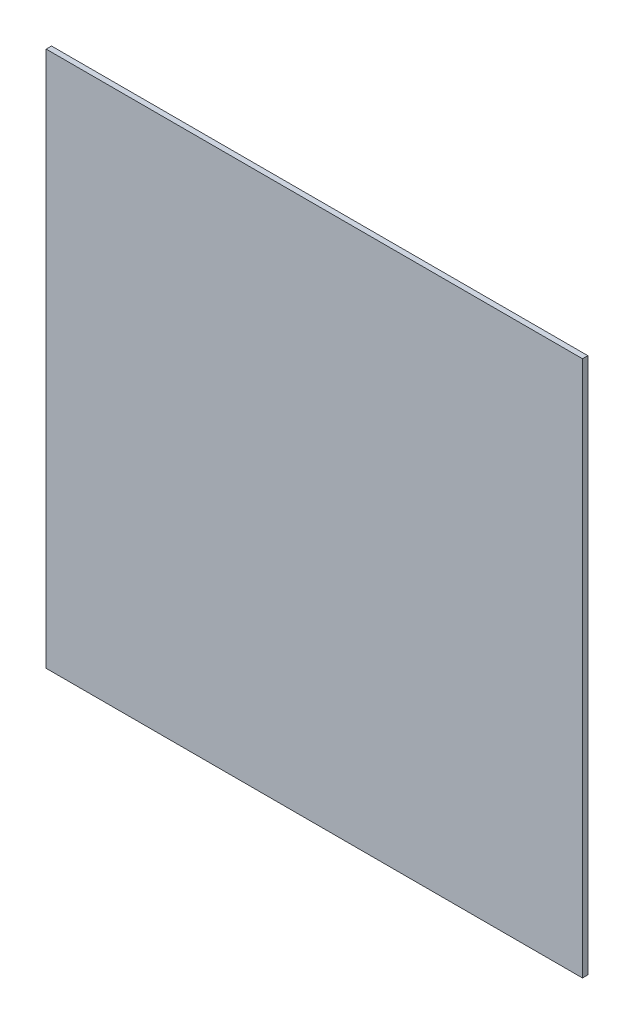
ISO-10303-21;
HEADER;
FILE_DESCRIPTION(('STEP AP214'),'2;1');
FILE_NAME('part.step','',(''),(''),'','','');
FILE_SCHEMA(('AUTOMOTIVE_DESIGN { 1 0 10303 214 1 1 1 1 }'));
ENDSEC;
DATA;
#1=APPLICATION_CONTEXT('core data for automotive mechanical design processes');
#2=APPLICATION_PROTOCOL_DEFINITION('international standard','automotive_design',2000,#1);
#3=PRODUCT_CONTEXT('',#1,'mechanical');
#4=PRODUCT('Part','Part','',(#3));
#5=PRODUCT_RELATED_PRODUCT_CATEGORY('part','',(#4));
#6=PRODUCT_DEFINITION_FORMATION('','',#4);
#7=PRODUCT_DEFINITION_CONTEXT('part definition',#1,'design');
#8=PRODUCT_DEFINITION('design','',#6,#7);
#9=PRODUCT_DEFINITION_SHAPE('','',#8);
#10=(LENGTH_UNIT() NAMED_UNIT(*) SI_UNIT(.MILLI.,.METRE.));
#11=(NAMED_UNIT(*) PLANE_ANGLE_UNIT() SI_UNIT($,.RADIAN.));
#12=(NAMED_UNIT(*) SI_UNIT($,.STERADIAN.) SOLID_ANGLE_UNIT());
#13=UNCERTAINTY_MEASURE_WITH_UNIT(LENGTH_MEASURE(1.E-05),#10,'distance_accuracy_value','');
#14=(GEOMETRIC_REPRESENTATION_CONTEXT(3) GLOBAL_UNCERTAINTY_ASSIGNED_CONTEXT((#13)) GLOBAL_UNIT_ASSIGNED_CONTEXT((#10,
#11,#12)) REPRESENTATION_CONTEXT('',''));
#15=CARTESIAN_POINT('',(0.,0.,0.));
#16=DIRECTION('',(0.,0.,1.));
#17=DIRECTION('',(1.,0.,0.));
#18=AXIS2_PLACEMENT_3D('',#15,#16,#17);
#19=CARTESIAN_POINT('',(0.,0.,4.));
#20=DIRECTION('',(1.,0.,0.));
#21=DIRECTION('',(0.,1.,0.));
#22=AXIS2_PLACEMENT_3D('',#19,#20,#21);
#23=PLANE('',#22);
#24=DIRECTION('',(0.,-1.,0.));
#25=VECTOR('',#24,1.);
#26=CARTESIAN_POINT('',(0.,0.,0.));
#27=LINE('',#26,#25);
#28=CARTESIAN_POINT('',(0.,0.,0.));
#29=VERTEX_POINT('',#28);
#30=CARTESIAN_POINT('',(0.,-400.,0.));
#31=VERTEX_POINT('',#30);
#32=EDGE_CURVE('E100',#29,#31,#27,.T.);
#33=ORIENTED_EDGE('',*,*,#32,.T.);
#34=DIRECTION('',(0.,0.,-1.));
#35=VECTOR('',#34,1.);
#36=CARTESIAN_POINT('',(0.,-400.,4.));
#37=LINE('',#36,#35);
#38=CARTESIAN_POINT('',(0.,-400.,4.));
#39=VERTEX_POINT('',#38);
#40=EDGE_CURVE('E11',#39,#31,#37,.T.);
#41=ORIENTED_EDGE('',*,*,#40,.F.);
#42=DIRECTION('',(0.,-1.,0.));
#43=VECTOR('',#42,1.);
#44=CARTESIAN_POINT('',(0.,0.,4.));
#45=LINE('',#44,#43);
#46=CARTESIAN_POINT('',(0.,0.,4.));
#47=VERTEX_POINT('',#46);
#48=EDGE_CURVE('E88',#47,#39,#45,.T.);
#49=ORIENTED_EDGE('',*,*,#48,.F.);
#50=DIRECTION('',(0.,0.,-1.));
#51=VECTOR('',#50,1.);
#52=CARTESIAN_POINT('',(0.,0.,4.));
#53=LINE('',#52,#51);
#54=EDGE_CURVE('E96',#47,#29,#53,.T.);
#55=ORIENTED_EDGE('',*,*,#54,.T.);
#56=EDGE_LOOP('',(#33,#41,#49,#55));
#57=FACE_BOUND('',#56,.T.);
#58=ADVANCED_FACE('F37',(#57),#23,.F.);
#59=CARTESIAN_POINT('',(0.,-400.,4.));
#60=DIRECTION('',(0.,1.,0.));
#61=DIRECTION('',(0.,0.,1.));
#62=AXIS2_PLACEMENT_3D('',#59,#60,#61);
#63=PLANE('',#62);
#64=DIRECTION('',(1.,0.,0.));
#65=VECTOR('',#64,1.);
#66=CARTESIAN_POINT('',(0.,-400.,0.));
#67=LINE('',#66,#65);
#68=CARTESIAN_POINT('',(400.,-400.,0.));
#69=VERTEX_POINT('',#68);
#70=EDGE_CURVE('E92',#31,#69,#67,.T.);
#71=ORIENTED_EDGE('',*,*,#70,.T.);
#72=DIRECTION('',(0.,0.,-1.));
#73=VECTOR('',#72,1.);
#74=CARTESIAN_POINT('',(400.,-400.,4.));
#75=LINE('',#74,#73);
#76=CARTESIAN_POINT('',(400.,-400.,4.));
#77=VERTEX_POINT('',#76);
#78=EDGE_CURVE('E45',#77,#69,#75,.T.);
#79=ORIENTED_EDGE('',*,*,#78,.F.);
#80=DIRECTION('',(1.,0.,0.));
#81=VECTOR('',#80,1.);
#82=CARTESIAN_POINT('',(0.,-400.,4.));
#83=LINE('',#82,#81);
#84=EDGE_CURVE('E83',#39,#77,#83,.T.);
#85=ORIENTED_EDGE('',*,*,#84,.F.);
#86=ORIENTED_EDGE('',*,*,#40,.T.);
#87=EDGE_LOOP('',(#71,#79,#85,#86));
#88=FACE_BOUND('',#87,.T.);
#89=ADVANCED_FACE('F91',(#88),#63,.F.);
#90=CARTESIAN_POINT('',(400.,0.,4.));
#91=DIRECTION('',(-1.,0.,0.));
#92=DIRECTION('',(0.,-1.,0.));
#93=AXIS2_PLACEMENT_3D('',#90,#91,#92);
#94=PLANE('',#93);
#95=DIRECTION('',(0.,1.,0.));
#96=VECTOR('',#95,1.);
#97=CARTESIAN_POINT('',(400.,0.,0.));
#98=LINE('',#97,#96);
#99=CARTESIAN_POINT('',(400.,0.,0.));
#100=VERTEX_POINT('',#99);
#101=EDGE_CURVE('E70',#69,#100,#98,.T.);
#102=ORIENTED_EDGE('',*,*,#101,.T.);
#103=DIRECTION('',(0.,0.,-1.));
#104=VECTOR('',#103,1.);
#105=CARTESIAN_POINT('',(400.,0.,4.));
#106=LINE('',#105,#104);
#107=CARTESIAN_POINT('',(400.,0.,4.));
#108=VERTEX_POINT('',#107);
#109=EDGE_CURVE('E93',#108,#100,#106,.T.);
#110=ORIENTED_EDGE('',*,*,#109,.F.);
#111=DIRECTION('',(0.,1.,0.));
#112=VECTOR('',#111,1.);
#113=CARTESIAN_POINT('',(400.,0.,4.));
#114=LINE('',#113,#112);
#115=EDGE_CURVE('E86',#77,#108,#114,.T.);
#116=ORIENTED_EDGE('',*,*,#115,.F.);
#117=ORIENTED_EDGE('',*,*,#78,.T.);
#118=EDGE_LOOP('',(#102,#110,#116,#117));
#119=FACE_BOUND('',#118,.T.);
#120=ADVANCED_FACE('F94',(#119),#94,.F.);
#121=CARTESIAN_POINT('',(0.,0.,4.));
#122=DIRECTION('',(0.,-1.,0.));
#123=DIRECTION('',(0.,0.,-1.));
#124=AXIS2_PLACEMENT_3D('',#121,#122,#123);
#125=PLANE('',#124);
#126=DIRECTION('',(-1.,0.,0.));
#127=VECTOR('',#126,1.);
#128=CARTESIAN_POINT('',(0.,0.,0.));
#129=LINE('',#128,#127);
#130=EDGE_CURVE('E76',#100,#29,#129,.T.);
#131=ORIENTED_EDGE('',*,*,#130,.T.);
#132=ORIENTED_EDGE('',*,*,#54,.F.);
#133=DIRECTION('',(-1.,0.,0.));
#134=VECTOR('',#133,1.);
#135=CARTESIAN_POINT('',(0.,0.,4.));
#136=LINE('',#135,#134);
#137=EDGE_CURVE('E53',#108,#47,#136,.T.);
#138=ORIENTED_EDGE('',*,*,#137,.F.);
#139=ORIENTED_EDGE('',*,*,#109,.T.);
#140=EDGE_LOOP('',(#131,#132,#138,#139));
#141=FACE_BOUND('',#140,.T.);
#142=ADVANCED_FACE('F107',(#141),#125,.F.);
#143=CARTESIAN_POINT('',(0.,0.,4.));
#144=DIRECTION('',(0.,0.,1.));
#145=DIRECTION('',(1.,0.,0.));
#146=AXIS2_PLACEMENT_3D('',#143,#144,#145);
#147=PLANE('',#146);
#148=ORIENTED_EDGE('',*,*,#48,.T.);
#149=ORIENTED_EDGE('',*,*,#84,.T.);
#150=ORIENTED_EDGE('',*,*,#115,.T.);
#151=ORIENTED_EDGE('',*,*,#137,.T.);
#152=EDGE_LOOP('',(#148,#149,#150,#151));
#153=FACE_BOUND('',#152,.T.);
#154=ADVANCED_FACE('F84',(#153),#147,.T.);
#155=CARTESIAN_POINT('',(0.,0.,0.));
#156=DIRECTION('',(0.,0.,1.));
#157=DIRECTION('',(1.,0.,0.));
#158=AXIS2_PLACEMENT_3D('',#155,#156,#157);
#159=PLANE('',#158);
#160=ORIENTED_EDGE('',*,*,#32,.F.);
#161=ORIENTED_EDGE('',*,*,#130,.F.);
#162=ORIENTED_EDGE('',*,*,#101,.F.);
#163=ORIENTED_EDGE('',*,*,#70,.F.);
#164=EDGE_LOOP('',(#160,#161,#162,#163));
#165=FACE_BOUND('',#164,.T.);
#166=ADVANCED_FACE('F110',(#165),#159,.F.);
#167=CLOSED_SHELL('',(#58,#89,#120,#142,#154,#166));
#168=MANIFOLD_SOLID_BREP('B2',#167);
#169=ADVANCED_BREP_SHAPE_REPRESENTATION('',(#18,#168),#14);
#170=SHAPE_DEFINITION_REPRESENTATION(#9,#169);
ENDSEC;
END-ISO-10303-21;
